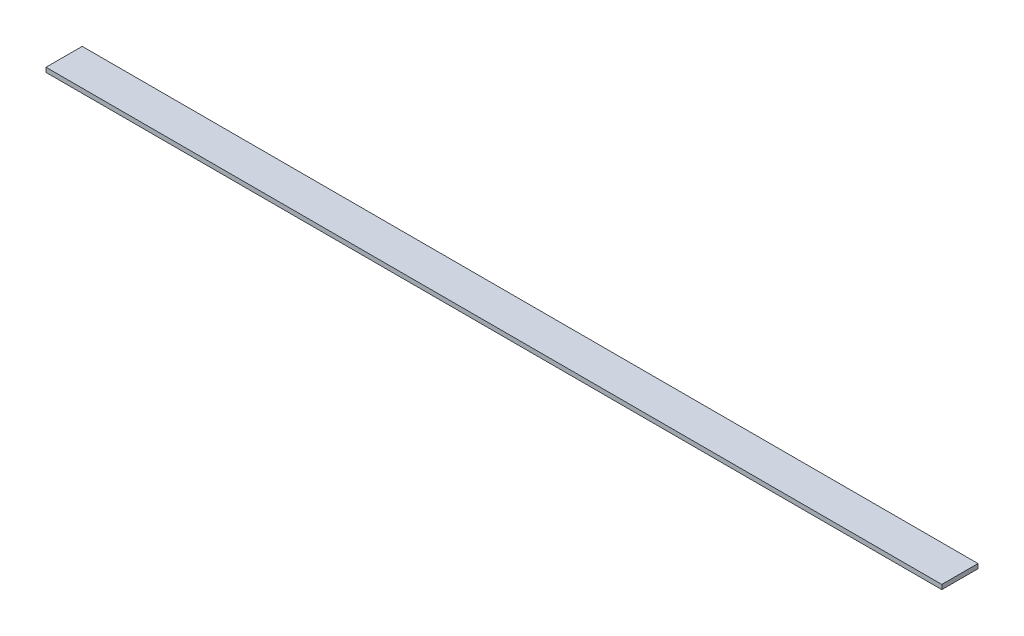
ISO-10303-21;
HEADER;
FILE_DESCRIPTION(('STEP AP214'),'2;1');
FILE_NAME('part.step','',(''),(''),'','','');
FILE_SCHEMA(('AUTOMOTIVE_DESIGN { 1 0 10303 214 1 1 1 1 }'));
ENDSEC;
DATA;
#1=APPLICATION_CONTEXT('core data for automotive mechanical design processes');
#2=APPLICATION_PROTOCOL_DEFINITION('international standard','automotive_design',2000,#1);
#3=PRODUCT_CONTEXT('',#1,'mechanical');
#4=PRODUCT('Part','Part','',(#3));
#5=PRODUCT_RELATED_PRODUCT_CATEGORY('part','',(#4));
#6=PRODUCT_DEFINITION_FORMATION('','',#4);
#7=PRODUCT_DEFINITION_CONTEXT('part definition',#1,'design');
#8=PRODUCT_DEFINITION('design','',#6,#7);
#9=PRODUCT_DEFINITION_SHAPE('','',#8);
#10=(LENGTH_UNIT() NAMED_UNIT(*) SI_UNIT(.MILLI.,.METRE.));
#11=(NAMED_UNIT(*) PLANE_ANGLE_UNIT() SI_UNIT($,.RADIAN.));
#12=(NAMED_UNIT(*) SI_UNIT($,.STERADIAN.) SOLID_ANGLE_UNIT());
#13=UNCERTAINTY_MEASURE_WITH_UNIT(LENGTH_MEASURE(1.E-05),#10,'distance_accuracy_value','');
#14=(GEOMETRIC_REPRESENTATION_CONTEXT(3) GLOBAL_UNCERTAINTY_ASSIGNED_CONTEXT((#13)) GLOBAL_UNIT_ASSIGNED_CONTEXT((#10,
#11,#12)) REPRESENTATION_CONTEXT('',''));
#15=CARTESIAN_POINT('',(0.,0.,0.));
#16=DIRECTION('',(0.,0.,1.));
#17=DIRECTION('',(1.,0.,0.));
#18=AXIS2_PLACEMENT_3D('',#15,#16,#17);
#19=CARTESIAN_POINT('',(628.65,6.35,-25.4));
#20=DIRECTION('',(-1.,0.,0.));
#21=DIRECTION('',(0.,0.,1.));
#22=AXIS2_PLACEMENT_3D('',#19,#20,#21);
#23=PLANE('',#22);
#24=DIRECTION('',(0.,0.,-1.));
#25=VECTOR('',#24,1.);
#26=CARTESIAN_POINT('',(628.65,0.,-25.4));
#27=LINE('',#26,#25);
#28=CARTESIAN_POINT('',(628.65,0.,25.4));
#29=VERTEX_POINT('',#28);
#30=CARTESIAN_POINT('',(628.65,0.,-25.4));
#31=VERTEX_POINT('',#30);
#32=EDGE_CURVE('E97',#29,#31,#27,.T.);
#33=ORIENTED_EDGE('',*,*,#32,.T.);
#34=DIRECTION('',(0.,-1.,0.));
#35=VECTOR('',#34,1.);
#36=CARTESIAN_POINT('',(628.65,6.35,-25.4));
#37=LINE('',#36,#35);
#38=CARTESIAN_POINT('',(628.65,6.35,-25.4));
#39=VERTEX_POINT('',#38);
#40=EDGE_CURVE('E11',#39,#31,#37,.T.);
#41=ORIENTED_EDGE('',*,*,#40,.F.);
#42=DIRECTION('',(0.,0.,-1.));
#43=VECTOR('',#42,1.);
#44=CARTESIAN_POINT('',(628.65,6.35,-25.4));
#45=LINE('',#44,#43);
#46=CARTESIAN_POINT('',(628.65,6.35,25.4));
#47=VERTEX_POINT('',#46);
#48=EDGE_CURVE('E85',#47,#39,#45,.T.);
#49=ORIENTED_EDGE('',*,*,#48,.F.);
#50=DIRECTION('',(0.,-1.,0.));
#51=VECTOR('',#50,1.);
#52=CARTESIAN_POINT('',(628.65,6.35,25.4));
#53=LINE('',#52,#51);
#54=EDGE_CURVE('E93',#47,#29,#53,.T.);
#55=ORIENTED_EDGE('',*,*,#54,.T.);
#56=EDGE_LOOP('',(#33,#41,#49,#55));
#57=FACE_BOUND('',#56,.T.);
#58=ADVANCED_FACE('F34',(#57),#23,.F.);
#59=CARTESIAN_POINT('',(-628.65,6.35,-25.4));
#60=DIRECTION('',(0.,0.,1.));
#61=DIRECTION('',(1.,0.,0.));
#62=AXIS2_PLACEMENT_3D('',#59,#60,#61);
#63=PLANE('',#62);
#64=DIRECTION('',(-1.,0.,0.));
#65=VECTOR('',#64,1.);
#66=CARTESIAN_POINT('',(-628.65,0.,-25.4));
#67=LINE('',#66,#65);
#68=CARTESIAN_POINT('',(-628.65,0.,-25.4));
#69=VERTEX_POINT('',#68);
#70=EDGE_CURVE('E89',#31,#69,#67,.T.);
#71=ORIENTED_EDGE('',*,*,#70,.T.);
#72=DIRECTION('',(0.,-1.,0.));
#73=VECTOR('',#72,1.);
#74=CARTESIAN_POINT('',(-628.65,6.35,-25.4));
#75=LINE('',#74,#73);
#76=CARTESIAN_POINT('',(-628.65,6.35,-25.4));
#77=VERTEX_POINT('',#76);
#78=EDGE_CURVE('E42',#77,#69,#75,.T.);
#79=ORIENTED_EDGE('',*,*,#78,.F.);
#80=DIRECTION('',(-1.,0.,0.));
#81=VECTOR('',#80,1.);
#82=CARTESIAN_POINT('',(-628.65,6.35,-25.4));
#83=LINE('',#82,#81);
#84=EDGE_CURVE('E80',#39,#77,#83,.T.);
#85=ORIENTED_EDGE('',*,*,#84,.F.);
#86=ORIENTED_EDGE('',*,*,#40,.T.);
#87=EDGE_LOOP('',(#71,#79,#85,#86));
#88=FACE_BOUND('',#87,.T.);
#89=ADVANCED_FACE('F88',(#88),#63,.F.);
#90=CARTESIAN_POINT('',(-628.65,6.35,-25.4));
#91=DIRECTION('',(1.,0.,0.));
#92=DIRECTION('',(0.,0.,-1.));
#93=AXIS2_PLACEMENT_3D('',#90,#91,#92);
#94=PLANE('',#93);
#95=DIRECTION('',(0.,0.,1.));
#96=VECTOR('',#95,1.);
#97=CARTESIAN_POINT('',(-628.65,0.,-25.4));
#98=LINE('',#97,#96);
#99=CARTESIAN_POINT('',(-628.65,0.,25.4));
#100=VERTEX_POINT('',#99);
#101=EDGE_CURVE('E67',#69,#100,#98,.T.);
#102=ORIENTED_EDGE('',*,*,#101,.T.);
#103=DIRECTION('',(0.,-1.,0.));
#104=VECTOR('',#103,1.);
#105=CARTESIAN_POINT('',(-628.65,6.35,25.4));
#106=LINE('',#105,#104);
#107=CARTESIAN_POINT('',(-628.65,6.35,25.4));
#108=VERTEX_POINT('',#107);
#109=EDGE_CURVE('E90',#108,#100,#106,.T.);
#110=ORIENTED_EDGE('',*,*,#109,.F.);
#111=DIRECTION('',(0.,0.,1.));
#112=VECTOR('',#111,1.);
#113=CARTESIAN_POINT('',(-628.65,6.35,-25.4));
#114=LINE('',#113,#112);
#115=EDGE_CURVE('E83',#77,#108,#114,.T.);
#116=ORIENTED_EDGE('',*,*,#115,.F.);
#117=ORIENTED_EDGE('',*,*,#78,.T.);
#118=EDGE_LOOP('',(#102,#110,#116,#117));
#119=FACE_BOUND('',#118,.T.);
#120=ADVANCED_FACE('F91',(#119),#94,.F.);
#121=CARTESIAN_POINT('',(-628.65,6.35,25.4));
#122=DIRECTION('',(0.,0.,-1.));
#123=DIRECTION('',(-1.,0.,0.));
#124=AXIS2_PLACEMENT_3D('',#121,#122,#123);
#125=PLANE('',#124);
#126=DIRECTION('',(1.,0.,0.));
#127=VECTOR('',#126,1.);
#128=CARTESIAN_POINT('',(-628.65,0.,25.4));
#129=LINE('',#128,#127);
#130=EDGE_CURVE('E73',#100,#29,#129,.T.);
#131=ORIENTED_EDGE('',*,*,#130,.T.);
#132=ORIENTED_EDGE('',*,*,#54,.F.);
#133=DIRECTION('',(1.,0.,0.));
#134=VECTOR('',#133,1.);
#135=CARTESIAN_POINT('',(-628.65,6.35,25.4));
#136=LINE('',#135,#134);
#137=EDGE_CURVE('E50',#108,#47,#136,.T.);
#138=ORIENTED_EDGE('',*,*,#137,.F.);
#139=ORIENTED_EDGE('',*,*,#109,.T.);
#140=EDGE_LOOP('',(#131,#132,#138,#139));
#141=FACE_BOUND('',#140,.T.);
#142=ADVANCED_FACE('F104',(#141),#125,.F.);
#143=CARTESIAN_POINT('',(0.,6.35,0.));
#144=DIRECTION('',(0.,1.,0.));
#145=DIRECTION('',(0.,0.,1.));
#146=AXIS2_PLACEMENT_3D('',#143,#144,#145);
#147=PLANE('',#146);
#148=ORIENTED_EDGE('',*,*,#48,.T.);
#149=ORIENTED_EDGE('',*,*,#84,.T.);
#150=ORIENTED_EDGE('',*,*,#115,.T.);
#151=ORIENTED_EDGE('',*,*,#137,.T.);
#152=EDGE_LOOP('',(#148,#149,#150,#151));
#153=FACE_BOUND('',#152,.T.);
#154=ADVANCED_FACE('F81',(#153),#147,.T.);
#155=CARTESIAN_POINT('',(0.,0.,0.));
#156=DIRECTION('',(0.,1.,0.));
#157=DIRECTION('',(0.,0.,1.));
#158=AXIS2_PLACEMENT_3D('',#155,#156,#157);
#159=PLANE('',#158);
#160=ORIENTED_EDGE('',*,*,#32,.F.);
#161=ORIENTED_EDGE('',*,*,#130,.F.);
#162=ORIENTED_EDGE('',*,*,#101,.F.);
#163=ORIENTED_EDGE('',*,*,#70,.F.);
#164=EDGE_LOOP('',(#160,#161,#162,#163));
#165=FACE_BOUND('',#164,.T.);
#166=ADVANCED_FACE('F107',(#165),#159,.F.);
#167=CLOSED_SHELL('',(#58,#89,#120,#142,#154,#166));
#168=MANIFOLD_SOLID_BREP('B2',#167);
#169=ADVANCED_BREP_SHAPE_REPRESENTATION('',(#18,#168),#14);
#170=SHAPE_DEFINITION_REPRESENTATION(#9,#169);
ENDSEC;
END-ISO-10303-21;
